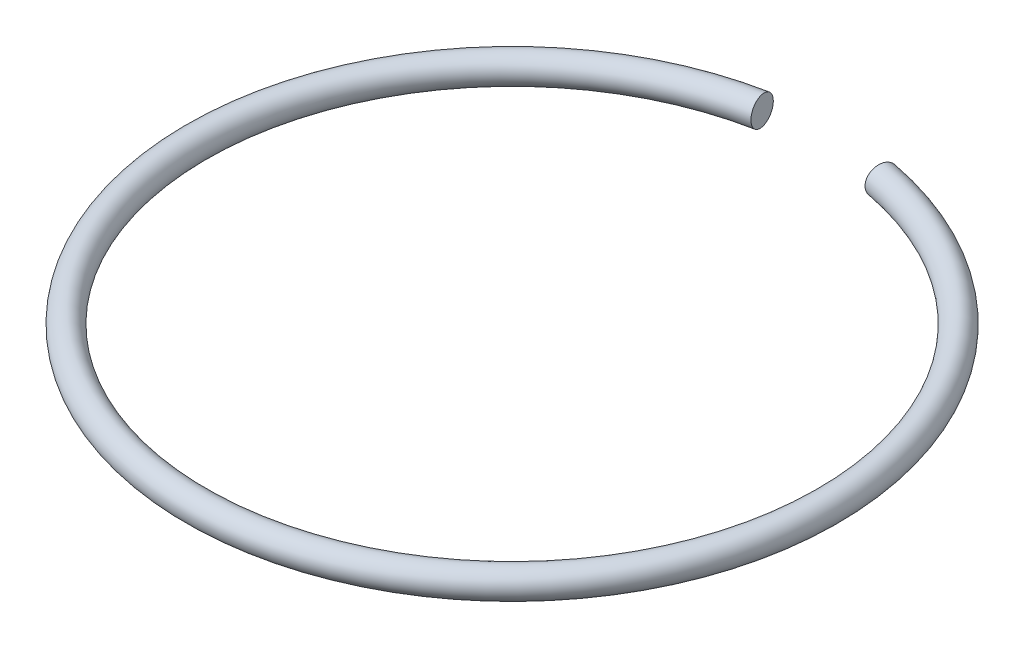
ISO-10303-21;
HEADER;
FILE_DESCRIPTION(('STEP AP214'),'2;1');
FILE_NAME('part.step','',(''),(''),'','','');
FILE_SCHEMA(('AUTOMOTIVE_DESIGN { 1 0 10303 214 1 1 1 1 }'));
ENDSEC;
DATA;
#1=APPLICATION_CONTEXT('core data for automotive mechanical design processes');
#2=APPLICATION_PROTOCOL_DEFINITION('international standard','automotive_design',2000,#1);
#3=PRODUCT_CONTEXT('',#1,'mechanical');
#4=PRODUCT('Part','Part','',(#3));
#5=PRODUCT_RELATED_PRODUCT_CATEGORY('part','',(#4));
#6=PRODUCT_DEFINITION_FORMATION('','',#4);
#7=PRODUCT_DEFINITION_CONTEXT('part definition',#1,'design');
#8=PRODUCT_DEFINITION('design','',#6,#7);
#9=PRODUCT_DEFINITION_SHAPE('','',#8);
#10=(LENGTH_UNIT() NAMED_UNIT(*) SI_UNIT(.MILLI.,.METRE.));
#11=(NAMED_UNIT(*) PLANE_ANGLE_UNIT() SI_UNIT($,.RADIAN.));
#12=(NAMED_UNIT(*) SI_UNIT($,.STERADIAN.) SOLID_ANGLE_UNIT());
#13=UNCERTAINTY_MEASURE_WITH_UNIT(LENGTH_MEASURE(1.E-05),#10,'distance_accuracy_value','');
#14=(GEOMETRIC_REPRESENTATION_CONTEXT(3) GLOBAL_UNCERTAINTY_ASSIGNED_CONTEXT((#13)) GLOBAL_UNIT_ASSIGNED_CONTEXT((#10,
#11,#12)) REPRESENTATION_CONTEXT('',''));
#15=CARTESIAN_POINT('',(0.,0.,0.));
#16=DIRECTION('',(0.,0.,1.));
#17=DIRECTION('',(1.,0.,0.));
#18=AXIS2_PLACEMENT_3D('',#15,#16,#17);
#19=CARTESIAN_POINT('',(0.,0.,0.));
#20=DIRECTION('',(0.,-1.,0.));
#21=DIRECTION('',(0.,0.,-1.));
#22=AXIS2_PLACEMENT_3D('',#19,#20,#21);
#23=TOROIDAL_SURFACE('',#22,33.5,1.5);
#24=CARTESIAN_POINT('',(6.34381578555359,0.,-32.8938596287964));
#25=DIRECTION('',(0.981906257576012,0.,0.189367635389659));
#26=DIRECTION('',(0.189367635389659,0.,-0.981906257576012));
#27=AXIS2_PLACEMENT_3D('',#24,#25,#26);
#28=CIRCLE('',#27,1.5);
#29=CARTESIAN_POINT('',(6.62786723863808,0.,-34.3667190151604));
#30=VERTEX_POINT('',#29);
#31=EDGE_CURVE('E37',#30,#30,#28,.T.);
#32=CARTESIAN_POINT('',(-6.34381578555359,0.,-32.8938596287964));
#33=DIRECTION('',(-0.981906257576012,0.,0.189367635389659));
#34=DIRECTION('',(0.189367635389659,0.,0.981906257576012));
#35=AXIS2_PLACEMENT_3D('',#32,#33,#34);
#36=CIRCLE('',#35,1.5);
#37=CARTESIAN_POINT('',(-6.62786723863808,0.,-34.3667190151604));
#38=VERTEX_POINT('',#37);
#39=EDGE_CURVE('E10',#38,#38,#36,.T.);
#40=CARTESIAN_POINT('',(0.,0.,0.));
#41=DIRECTION('',(0.,-1.,0.));
#42=DIRECTION('',(0.,0.,-1.));
#43=AXIS2_PLACEMENT_3D('',#40,#41,#42);
#44=CIRCLE('',#43,35.);
#45=EDGE_CURVE('',#30,#38,#44,.T.);
#46=ORIENTED_EDGE('',*,*,#31,.T.);
#47=ORIENTED_EDGE('',*,*,#39,.T.);
#48=ORIENTED_EDGE('',*,*,#45,.T.);
#49=ORIENTED_EDGE('',*,*,#45,.F.);
#50=EDGE_LOOP('',(#46,#48,#47,#49));
#51=FACE_BOUND('',#50,.T.);
#52=ADVANCED_FACE('F31',(#51),#23,.T.);
#53=CARTESIAN_POINT('',(0.,-1.5,0.));
#54=DIRECTION('',(0.981906257576012,0.,0.189367635389659));
#55=DIRECTION('',(0.189367635389659,0.,-0.981906257576012));
#56=AXIS2_PLACEMENT_3D('',#53,#54,#55);
#57=PLANE('',#56);
#58=ORIENTED_EDGE('',*,*,#31,.F.);
#59=EDGE_LOOP('',(#58));
#60=FACE_BOUND('',#59,.T.);
#61=ADVANCED_FACE('F44',(#60),#57,.F.);
#62=CARTESIAN_POINT('',(-6.75,-1.5,-35.));
#63=DIRECTION('',(-0.981906257576012,0.,0.189367635389659));
#64=DIRECTION('',(0.189367635389659,0.,0.981906257576012));
#65=AXIS2_PLACEMENT_3D('',#62,#63,#64);
#66=PLANE('',#65);
#67=ORIENTED_EDGE('',*,*,#39,.F.);
#68=EDGE_LOOP('',(#67));
#69=FACE_BOUND('',#68,.T.);
#70=ADVANCED_FACE('F46',(#69),#66,.F.);
#71=CLOSED_SHELL('',(#52,#61,#70));
#72=MANIFOLD_SOLID_BREP('B2',#71);
#73=ADVANCED_BREP_SHAPE_REPRESENTATION('',(#18,#72),#14);
#74=SHAPE_DEFINITION_REPRESENTATION(#9,#73);
ENDSEC;
END-ISO-10303-21;
